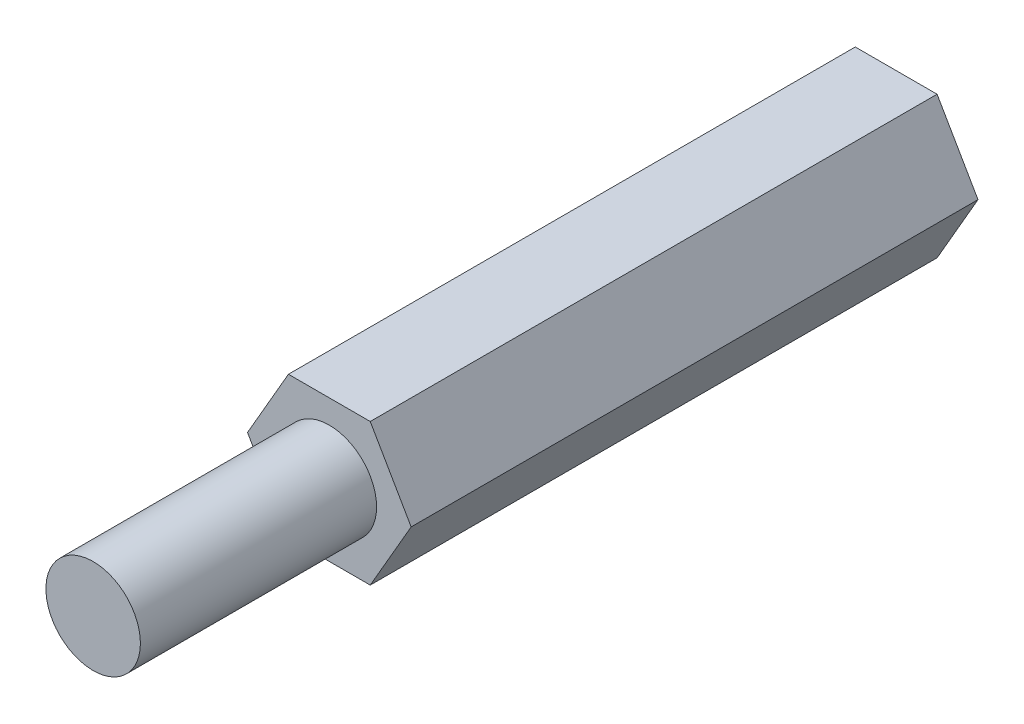
ISO-10303-21;
HEADER;
FILE_DESCRIPTION(('STEP AP214'),'2;1');
FILE_NAME('part.step','',(''),(''),'','','');
FILE_SCHEMA(('AUTOMOTIVE_DESIGN { 1 0 10303 214 1 1 1 1 }'));
ENDSEC;
DATA;
#1=APPLICATION_CONTEXT('core data for automotive mechanical design processes');
#2=APPLICATION_PROTOCOL_DEFINITION('international standard','automotive_design',2000,#1);
#3=PRODUCT_CONTEXT('',#1,'mechanical');
#4=PRODUCT('Part','Part','',(#3));
#5=PRODUCT_RELATED_PRODUCT_CATEGORY('part','',(#4));
#6=PRODUCT_DEFINITION_FORMATION('','',#4);
#7=PRODUCT_DEFINITION_CONTEXT('part definition',#1,'design');
#8=PRODUCT_DEFINITION('design','',#6,#7);
#9=PRODUCT_DEFINITION_SHAPE('','',#8);
#10=(LENGTH_UNIT() NAMED_UNIT(*) SI_UNIT(.MILLI.,.METRE.));
#11=(NAMED_UNIT(*) PLANE_ANGLE_UNIT() SI_UNIT($,.RADIAN.));
#12=(NAMED_UNIT(*) SI_UNIT($,.STERADIAN.) SOLID_ANGLE_UNIT());
#13=UNCERTAINTY_MEASURE_WITH_UNIT(LENGTH_MEASURE(1.E-05),#10,'distance_accuracy_value','');
#14=(GEOMETRIC_REPRESENTATION_CONTEXT(3) GLOBAL_UNCERTAINTY_ASSIGNED_CONTEXT((#13)) GLOBAL_UNIT_ASSIGNED_CONTEXT((#10,
#11,#12)) REPRESENTATION_CONTEXT('',''));
#15=CARTESIAN_POINT('',(0.,0.,0.));
#16=DIRECTION('',(0.,0.,1.));
#17=DIRECTION('',(1.,0.,0.));
#18=AXIS2_PLACEMENT_3D('',#15,#16,#17);
#19=CARTESIAN_POINT('',(-0.866025403784438,-1.5,12.));
#20=DIRECTION('',(0.,1.,0.));
#21=DIRECTION('',(-1.,0.,0.));
#22=AXIS2_PLACEMENT_3D('',#19,#20,#21);
#23=PLANE('',#22);
#24=DIRECTION('',(1.,0.,0.));
#25=VECTOR('',#24,1.);
#26=CARTESIAN_POINT('',(-0.866025403784438,-1.5,0.));
#27=LINE('',#26,#25);
#28=CARTESIAN_POINT('',(-0.866025403784438,-1.5,0.));
#29=VERTEX_POINT('',#28);
#30=CARTESIAN_POINT('',(0.866025403784439,-1.5,0.));
#31=VERTEX_POINT('',#30);
#32=EDGE_CURVE('E121',#29,#31,#27,.T.);
#33=ORIENTED_EDGE('',*,*,#32,.T.);
#34=DIRECTION('',(0.,0.,-1.));
#35=VECTOR('',#34,1.);
#36=CARTESIAN_POINT('',(0.866025403784439,-1.5,12.));
#37=LINE('',#36,#35);
#38=CARTESIAN_POINT('',(0.866025403784439,-1.5,12.));
#39=VERTEX_POINT('',#38);
#40=EDGE_CURVE('E36',#39,#31,#37,.T.);
#41=ORIENTED_EDGE('',*,*,#40,.F.);
#42=DIRECTION('',(1.,0.,0.));
#43=VECTOR('',#42,1.);
#44=CARTESIAN_POINT('',(-0.866025403784438,-1.5,12.));
#45=LINE('',#44,#43);
#46=CARTESIAN_POINT('',(-0.866025403784438,-1.5,12.));
#47=VERTEX_POINT('',#46);
#48=EDGE_CURVE('E132',#47,#39,#45,.T.);
#49=ORIENTED_EDGE('',*,*,#48,.F.);
#50=DIRECTION('',(0.,0.,-1.));
#51=VECTOR('',#50,1.);
#52=CARTESIAN_POINT('',(-0.866025403784438,-1.5,12.));
#53=LINE('',#52,#51);
#54=EDGE_CURVE('E117',#47,#29,#53,.T.);
#55=ORIENTED_EDGE('',*,*,#54,.T.);
#56=EDGE_LOOP('',(#33,#41,#49,#55));
#57=FACE_BOUND('',#56,.T.);
#58=ADVANCED_FACE('F33',(#57),#23,.F.);
#59=CARTESIAN_POINT('',(0.866025403784439,-1.5,12.));
#60=DIRECTION('',(-0.866025403784439,0.5,0.));
#61=DIRECTION('',(-0.5,-0.866025403784439,0.));
#62=AXIS2_PLACEMENT_3D('',#59,#60,#61);
#63=PLANE('',#62);
#64=DIRECTION('',(0.5,0.866025403784439,0.));
#65=VECTOR('',#64,1.);
#66=CARTESIAN_POINT('',(0.866025403784439,-1.5,0.));
#67=LINE('',#66,#65);
#68=CARTESIAN_POINT('',(1.73205080756888,0.,0.));
#69=VERTEX_POINT('',#68);
#70=EDGE_CURVE('E124',#31,#69,#67,.T.);
#71=ORIENTED_EDGE('',*,*,#70,.T.);
#72=DIRECTION('',(0.,0.,-1.));
#73=VECTOR('',#72,1.);
#74=CARTESIAN_POINT('',(1.73205080756888,0.,12.));
#75=LINE('',#74,#73);
#76=CARTESIAN_POINT('',(1.73205080756888,0.,12.));
#77=VERTEX_POINT('',#76);
#78=EDGE_CURVE('E135',#77,#69,#75,.T.);
#79=ORIENTED_EDGE('',*,*,#78,.F.);
#80=DIRECTION('',(0.5,0.866025403784439,0.));
#81=VECTOR('',#80,1.);
#82=CARTESIAN_POINT('',(0.866025403784439,-1.5,12.));
#83=LINE('',#82,#81);
#84=EDGE_CURVE('E89',#39,#77,#83,.T.);
#85=ORIENTED_EDGE('',*,*,#84,.F.);
#86=ORIENTED_EDGE('',*,*,#40,.T.);
#87=EDGE_LOOP('',(#71,#79,#85,#86));
#88=FACE_BOUND('',#87,.T.);
#89=ADVANCED_FACE('F140',(#88),#63,.F.);
#90=CARTESIAN_POINT('',(1.73205080756888,0.,12.));
#91=DIRECTION('',(-0.866025403784438,-0.5,0.));
#92=DIRECTION('',(0.5,-0.866025403784439,0.));
#93=AXIS2_PLACEMENT_3D('',#90,#91,#92);
#94=PLANE('',#93);
#95=DIRECTION('',(-0.5,0.866025403784439,0.));
#96=VECTOR('',#95,1.);
#97=CARTESIAN_POINT('',(1.73205080756888,0.,0.));
#98=LINE('',#97,#96);
#99=CARTESIAN_POINT('',(0.866025403784439,1.5,0.));
#100=VERTEX_POINT('',#99);
#101=EDGE_CURVE('E127',#69,#100,#98,.T.);
#102=ORIENTED_EDGE('',*,*,#101,.T.);
#103=DIRECTION('',(0.,0.,-1.));
#104=VECTOR('',#103,1.);
#105=CARTESIAN_POINT('',(0.866025403784439,1.5,12.));
#106=LINE('',#105,#104);
#107=CARTESIAN_POINT('',(0.866025403784439,1.5,12.));
#108=VERTEX_POINT('',#107);
#109=EDGE_CURVE('E112',#108,#100,#106,.T.);
#110=ORIENTED_EDGE('',*,*,#109,.F.);
#111=DIRECTION('',(-0.5,0.866025403784439,0.));
#112=VECTOR('',#111,1.);
#113=CARTESIAN_POINT('',(1.73205080756888,0.,12.));
#114=LINE('',#113,#112);
#115=EDGE_CURVE('E103',#77,#108,#114,.T.);
#116=ORIENTED_EDGE('',*,*,#115,.F.);
#117=ORIENTED_EDGE('',*,*,#78,.T.);
#118=EDGE_LOOP('',(#102,#110,#116,#117));
#119=FACE_BOUND('',#118,.T.);
#120=ADVANCED_FACE('F146',(#119),#94,.F.);
#121=CARTESIAN_POINT('',(0.866025403784439,1.5,12.));
#122=DIRECTION('',(0.,-1.,0.));
#123=DIRECTION('',(0.,0.,-1.));
#124=AXIS2_PLACEMENT_3D('',#121,#122,#123);
#125=PLANE('',#124);
#126=DIRECTION('',(-1.,0.,0.));
#127=VECTOR('',#126,1.);
#128=CARTESIAN_POINT('',(0.866025403784439,1.5,0.));
#129=LINE('',#128,#127);
#130=CARTESIAN_POINT('',(-0.866025403784439,1.5,0.));
#131=VERTEX_POINT('',#130);
#132=EDGE_CURVE('E111',#100,#131,#129,.T.);
#133=ORIENTED_EDGE('',*,*,#132,.T.);
#134=DIRECTION('',(0.,0.,-1.));
#135=VECTOR('',#134,1.);
#136=CARTESIAN_POINT('',(-0.866025403784439,1.5,12.));
#137=LINE('',#136,#135);
#138=CARTESIAN_POINT('',(-0.866025403784439,1.5,12.));
#139=VERTEX_POINT('',#138);
#140=EDGE_CURVE('E108',#139,#131,#137,.T.);
#141=ORIENTED_EDGE('',*,*,#140,.F.);
#142=DIRECTION('',(-1.,0.,0.));
#143=VECTOR('',#142,1.);
#144=CARTESIAN_POINT('',(0.866025403784439,1.5,12.));
#145=LINE('',#144,#143);
#146=EDGE_CURVE('E97',#108,#139,#145,.T.);
#147=ORIENTED_EDGE('',*,*,#146,.F.);
#148=ORIENTED_EDGE('',*,*,#109,.T.);
#149=EDGE_LOOP('',(#133,#141,#147,#148));
#150=FACE_BOUND('',#149,.T.);
#151=ADVANCED_FACE('F109',(#150),#125,.F.);
#152=CARTESIAN_POINT('',(-0.866025403784439,1.5,12.));
#153=DIRECTION('',(0.866025403784439,-0.5,0.));
#154=DIRECTION('',(0.5,0.866025403784439,0.));
#155=AXIS2_PLACEMENT_3D('',#152,#153,#154);
#156=PLANE('',#155);
#157=DIRECTION('',(-0.5,-0.866025403784439,0.));
#158=VECTOR('',#157,1.);
#159=CARTESIAN_POINT('',(-0.866025403784439,1.5,0.));
#160=LINE('',#159,#158);
#161=CARTESIAN_POINT('',(-1.73205080756888,0.,0.));
#162=VERTEX_POINT('',#161);
#163=EDGE_CURVE('E74',#131,#162,#160,.T.);
#164=ORIENTED_EDGE('',*,*,#163,.T.);
#165=DIRECTION('',(0.,0.,-1.));
#166=VECTOR('',#165,1.);
#167=CARTESIAN_POINT('',(-1.73205080756888,0.,12.));
#168=LINE('',#167,#166);
#169=CARTESIAN_POINT('',(-1.73205080756888,0.,12.));
#170=VERTEX_POINT('',#169);
#171=EDGE_CURVE('E113',#170,#162,#168,.T.);
#172=ORIENTED_EDGE('',*,*,#171,.F.);
#173=DIRECTION('',(-0.5,-0.866025403784439,0.));
#174=VECTOR('',#173,1.);
#175=CARTESIAN_POINT('',(-0.866025403784439,1.5,12.));
#176=LINE('',#175,#174);
#177=EDGE_CURVE('E101',#139,#170,#176,.T.);
#178=ORIENTED_EDGE('',*,*,#177,.F.);
#179=ORIENTED_EDGE('',*,*,#140,.T.);
#180=EDGE_LOOP('',(#164,#172,#178,#179));
#181=FACE_BOUND('',#180,.T.);
#182=ADVANCED_FACE('F115',(#181),#156,.F.);
#183=CARTESIAN_POINT('',(-1.73205080756888,0.,12.));
#184=DIRECTION('',(0.866025403784439,0.5,0.));
#185=DIRECTION('',(-0.5,0.866025403784439,0.));
#186=AXIS2_PLACEMENT_3D('',#183,#184,#185);
#187=PLANE('',#186);
#188=DIRECTION('',(0.5,-0.866025403784439,0.));
#189=VECTOR('',#188,1.);
#190=CARTESIAN_POINT('',(-1.73205080756888,0.,0.));
#191=LINE('',#190,#189);
#192=EDGE_CURVE('E80',#162,#29,#191,.T.);
#193=ORIENTED_EDGE('',*,*,#192,.T.);
#194=ORIENTED_EDGE('',*,*,#54,.F.);
#195=DIRECTION('',(0.5,-0.866025403784439,0.));
#196=VECTOR('',#195,1.);
#197=CARTESIAN_POINT('',(-1.73205080756888,0.,12.));
#198=LINE('',#197,#196);
#199=EDGE_CURVE('E50',#170,#47,#198,.T.);
#200=ORIENTED_EDGE('',*,*,#199,.F.);
#201=ORIENTED_EDGE('',*,*,#171,.T.);
#202=EDGE_LOOP('',(#193,#194,#200,#201));
#203=FACE_BOUND('',#202,.T.);
#204=ADVANCED_FACE('F171',(#203),#187,.F.);
#205=CARTESIAN_POINT('',(0.,0.,12.));
#206=DIRECTION('',(0.,0.,1.));
#207=DIRECTION('',(1.,0.,0.));
#208=AXIS2_PLACEMENT_3D('',#205,#206,#207);
#209=PLANE('',#208);
#210=CARTESIAN_POINT('',(0.,0.,12.));
#211=DIRECTION('',(0.,0.,1.));
#212=DIRECTION('',(1.,0.,0.));
#213=AXIS2_PLACEMENT_3D('',#210,#211,#212);
#214=CIRCLE('',#213,1.);
#215=CARTESIAN_POINT('',(1.,0.,12.));
#216=VERTEX_POINT('',#215);
#217=EDGE_CURVE('E11',#216,#216,#214,.T.);
#218=ORIENTED_EDGE('',*,*,#217,.F.);
#219=EDGE_LOOP('',(#218));
#220=FACE_BOUND('',#219,.T.);
#221=ORIENTED_EDGE('',*,*,#48,.T.);
#222=ORIENTED_EDGE('',*,*,#84,.T.);
#223=ORIENTED_EDGE('',*,*,#115,.T.);
#224=ORIENTED_EDGE('',*,*,#146,.T.);
#225=ORIENTED_EDGE('',*,*,#177,.T.);
#226=ORIENTED_EDGE('',*,*,#199,.T.);
#227=EDGE_LOOP('',(#221,#222,#223,#224,#225,#226));
#228=FACE_BOUND('',#227,.T.);
#229=ADVANCED_FACE('F99',(#220,#228),#209,.T.);
#230=CARTESIAN_POINT('',(0.,0.,0.));
#231=DIRECTION('',(0.,0.,1.));
#232=DIRECTION('',(1.,0.,0.));
#233=AXIS2_PLACEMENT_3D('',#230,#231,#232);
#234=PLANE('',#233);
#235=CARTESIAN_POINT('',(0.,0.,0.));
#236=DIRECTION('',(0.,0.,-1.));
#237=DIRECTION('',(-1.,0.,0.));
#238=AXIS2_PLACEMENT_3D('',#235,#236,#237);
#239=CIRCLE('',#238,1.19999999999999);
#240=CARTESIAN_POINT('',(-1.19999999999999,0.,0.));
#241=VERTEX_POINT('',#240);
#242=EDGE_CURVE('E155',#241,#241,#239,.T.);
#243=ORIENTED_EDGE('',*,*,#242,.F.);
#244=EDGE_LOOP('',(#243));
#245=FACE_BOUND('',#244,.T.);
#246=ORIENTED_EDGE('',*,*,#32,.F.);
#247=ORIENTED_EDGE('',*,*,#192,.F.);
#248=ORIENTED_EDGE('',*,*,#163,.F.);
#249=ORIENTED_EDGE('',*,*,#132,.F.);
#250=ORIENTED_EDGE('',*,*,#101,.F.);
#251=ORIENTED_EDGE('',*,*,#70,.F.);
#252=EDGE_LOOP('',(#246,#247,#248,#249,#250,#251));
#253=FACE_BOUND('',#252,.T.);
#254=ADVANCED_FACE('F145',(#245,#253),#234,.F.);
#255=CARTESIAN_POINT('',(0.,0.,17.));
#256=DIRECTION('',(0.,0.,-1.));
#257=DIRECTION('',(-1.,0.,0.));
#258=AXIS2_PLACEMENT_3D('',#255,#256,#257);
#259=CYLINDRICAL_SURFACE('',#258,1.);
#260=CARTESIAN_POINT('',(0.,0.,17.));
#261=DIRECTION('',(0.,0.,1.));
#262=DIRECTION('',(1.,0.,0.));
#263=AXIS2_PLACEMENT_3D('',#260,#261,#262);
#264=CIRCLE('',#263,1.);
#265=CARTESIAN_POINT('',(1.,0.,17.));
#266=VERTEX_POINT('',#265);
#267=EDGE_CURVE('E125',#266,#266,#264,.T.);
#268=ORIENTED_EDGE('',*,*,#267,.F.);
#269=EDGE_LOOP('',(#268));
#270=FACE_BOUND('',#269,.T.);
#271=ORIENTED_EDGE('',*,*,#217,.T.);
#272=EDGE_LOOP('',(#271));
#273=FACE_BOUND('',#272,.T.);
#274=ADVANCED_FACE('F162',(#270,#273),#259,.T.);
#275=CARTESIAN_POINT('',(0.,0.,17.));
#276=DIRECTION('',(0.,0.,1.));
#277=DIRECTION('',(1.,0.,0.));
#278=AXIS2_PLACEMENT_3D('',#275,#276,#277);
#279=PLANE('',#278);
#280=ORIENTED_EDGE('',*,*,#267,.T.);
#281=EDGE_LOOP('',(#280));
#282=FACE_BOUND('',#281,.T.);
#283=ADVANCED_FACE('F168',(#282),#279,.T.);
#284=CARTESIAN_POINT('',(0.,0.,3.));
#285=DIRECTION('',(0.,0.,-1.));
#286=DIRECTION('',(-1.,0.,0.));
#287=AXIS2_PLACEMENT_3D('',#284,#285,#286);
#288=CONICAL_SURFACE('',#287,1.2,1.02974425867665);
#289=CARTESIAN_POINT('',(0.,0.,3.72103274283307));
#290=VERTEX_POINT('',#289);
#291=VERTEX_LOOP('',#290);
#292=FACE_BOUND('',#291,.T.);
#293=CARTESIAN_POINT('',(0.,0.,3.));
#294=DIRECTION('',(0.,0.,-1.));
#295=DIRECTION('',(-1.,0.,0.));
#296=AXIS2_PLACEMENT_3D('',#293,#294,#295);
#297=CIRCLE('',#296,1.2);
#298=CARTESIAN_POINT('',(-1.2,0.,3.));
#299=VERTEX_POINT('',#298);
#300=EDGE_CURVE('E152',#299,#299,#297,.T.);
#301=ORIENTED_EDGE('',*,*,#300,.T.);
#302=EDGE_LOOP('',(#301));
#303=FACE_BOUND('',#302,.T.);
#304=ADVANCED_FACE('F211',(#292,#303),#288,.F.);
#305=CARTESIAN_POINT('',(0.,0.,0.));
#306=DIRECTION('',(0.,0.,-1.));
#307=DIRECTION('',(-1.,0.,0.));
#308=AXIS2_PLACEMENT_3D('',#305,#306,#307);
#309=CYLINDRICAL_SURFACE('',#308,1.19999999999999);
#310=ORIENTED_EDGE('',*,*,#300,.F.);
#311=EDGE_LOOP('',(#310));
#312=FACE_BOUND('',#311,.T.);
#313=ORIENTED_EDGE('',*,*,#242,.T.);
#314=EDGE_LOOP('',(#313));
#315=FACE_BOUND('',#314,.T.);
#316=ADVANCED_FACE('F159',(#312,#315),#309,.F.);
#317=CLOSED_SHELL('',(#58,#89,#120,#151,#182,#204,#229,#254,#274,#283,#304,#316));
#318=MANIFOLD_SOLID_BREP('B2',#317);
#319=ADVANCED_BREP_SHAPE_REPRESENTATION('',(#18,#318),#14);
#320=SHAPE_DEFINITION_REPRESENTATION(#9,#319);
ENDSEC;
END-ISO-10303-21;
